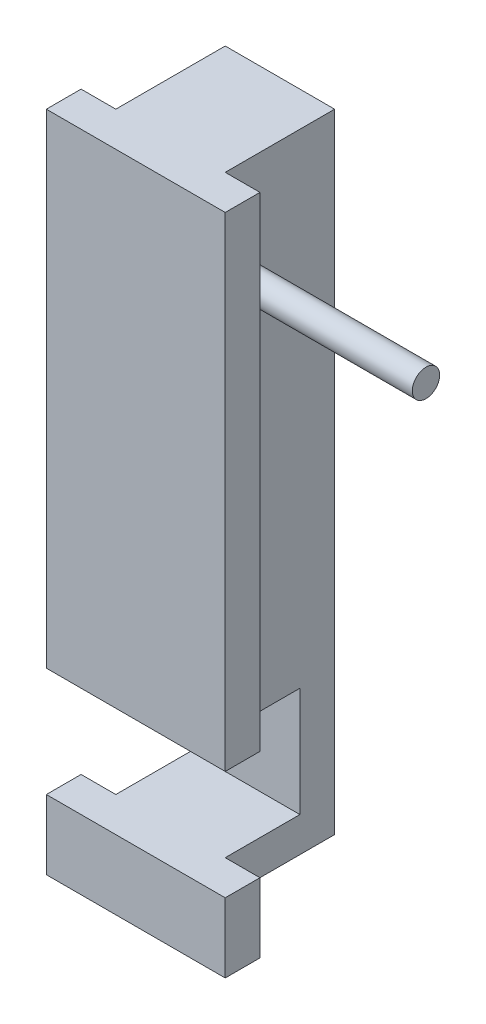
ISO-10303-21;
HEADER;
FILE_DESCRIPTION(('STEP AP214'),'2;1');
FILE_NAME('part.step','',(''),(''),'','','');
FILE_SCHEMA(('AUTOMOTIVE_DESIGN { 1 0 10303 214 1 1 1 1 }'));
ENDSEC;
DATA;
#1=APPLICATION_CONTEXT('core data for automotive mechanical design processes');
#2=APPLICATION_PROTOCOL_DEFINITION('international standard','automotive_design',2000,#1);
#3=PRODUCT_CONTEXT('',#1,'mechanical');
#4=PRODUCT('Part','Part','',(#3));
#5=PRODUCT_RELATED_PRODUCT_CATEGORY('part','',(#4));
#6=PRODUCT_DEFINITION_FORMATION('','',#4);
#7=PRODUCT_DEFINITION_CONTEXT('part definition',#1,'design');
#8=PRODUCT_DEFINITION('design','',#6,#7);
#9=PRODUCT_DEFINITION_SHAPE('','',#8);
#10=(LENGTH_UNIT() NAMED_UNIT(*) SI_UNIT(.MILLI.,.METRE.));
#11=(NAMED_UNIT(*) PLANE_ANGLE_UNIT() SI_UNIT($,.RADIAN.));
#12=(NAMED_UNIT(*) SI_UNIT($,.STERADIAN.) SOLID_ANGLE_UNIT());
#13=UNCERTAINTY_MEASURE_WITH_UNIT(LENGTH_MEASURE(1.E-05),#10,'distance_accuracy_value','');
#14=(GEOMETRIC_REPRESENTATION_CONTEXT(3) GLOBAL_UNCERTAINTY_ASSIGNED_CONTEXT((#13)) GLOBAL_UNIT_ASSIGNED_CONTEXT((#10,
#11,#12)) REPRESENTATION_CONTEXT('',''));
#15=CARTESIAN_POINT('',(0.,0.,0.));
#16=DIRECTION('',(0.,0.,1.));
#17=DIRECTION('',(1.,0.,0.));
#18=AXIS2_PLACEMENT_3D('',#15,#16,#17);
#19=CARTESIAN_POINT('',(32.7,0.,0.));
#20=DIRECTION('',(1.,0.,0.));
#21=DIRECTION('',(0.,0.,-1.));
#22=AXIS2_PLACEMENT_3D('',#19,#20,#21);
#23=PLANE('',#22);
#24=DIRECTION('',(0.,-1.,0.));
#25=VECTOR('',#24,1.);
#26=CARTESIAN_POINT('',(32.7,0.,-6.35));
#27=LINE('',#26,#25);
#28=CARTESIAN_POINT('',(32.7,88.5,-6.35));
#29=VERTEX_POINT('',#28);
#30=CARTESIAN_POINT('',(32.7,0.,-6.35));
#31=VERTEX_POINT('',#30);
#32=EDGE_CURVE('E48',#29,#31,#27,.T.);
#33=ORIENTED_EDGE('',*,*,#32,.F.);
#34=DIRECTION('',(0.,0.,1.));
#35=VECTOR('',#34,1.);
#36=CARTESIAN_POINT('',(32.7,88.5,-26.35));
#37=LINE('',#36,#35);
#38=CARTESIAN_POINT('',(32.7,88.5,0.));
#39=VERTEX_POINT('',#38);
#40=EDGE_CURVE('E64',#29,#39,#37,.T.);
#41=ORIENTED_EDGE('',*,*,#40,.T.);
#42=DIRECTION('',(0.,-1.,0.));
#43=VECTOR('',#42,1.);
#44=CARTESIAN_POINT('',(32.7,88.5,0.));
#45=LINE('',#44,#43);
#46=CARTESIAN_POINT('',(32.7,0.,0.));
#47=VERTEX_POINT('',#46);
#48=EDGE_CURVE('E161',#39,#47,#45,.T.);
#49=ORIENTED_EDGE('',*,*,#48,.T.);
#50=DIRECTION('',(0.,0.,-1.));
#51=VECTOR('',#50,1.);
#52=CARTESIAN_POINT('',(32.7,0.,0.));
#53=LINE('',#52,#51);
#54=EDGE_CURVE('E97',#47,#31,#53,.T.);
#55=ORIENTED_EDGE('',*,*,#54,.T.);
#56=EDGE_LOOP('',(#33,#41,#49,#55));
#57=FACE_BOUND('',#56,.T.);
#58=ADVANCED_FACE('F39',(#57),#23,.T.);
#59=CARTESIAN_POINT('',(0.,0.,0.));
#60=DIRECTION('',(1.,0.,0.));
#61=DIRECTION('',(0.,0.,-1.));
#62=AXIS2_PLACEMENT_3D('',#59,#60,#61);
#63=PLANE('',#62);
#64=DIRECTION('',(0.,0.,1.));
#65=VECTOR('',#64,1.);
#66=CARTESIAN_POINT('',(0.,88.5,-26.35));
#67=LINE('',#66,#65);
#68=CARTESIAN_POINT('',(0.,88.5,-6.35));
#69=VERTEX_POINT('',#68);
#70=CARTESIAN_POINT('',(0.,88.5,0.));
#71=VERTEX_POINT('',#70);
#72=EDGE_CURVE('E88',#69,#71,#67,.T.);
#73=ORIENTED_EDGE('',*,*,#72,.F.);
#74=DIRECTION('',(0.,-1.,0.));
#75=VECTOR('',#74,1.);
#76=CARTESIAN_POINT('',(0.,0.,-6.35));
#77=LINE('',#76,#75);
#78=CARTESIAN_POINT('',(0.,0.,-6.35));
#79=VERTEX_POINT('',#78);
#80=EDGE_CURVE('E191',#69,#79,#77,.T.);
#81=ORIENTED_EDGE('',*,*,#80,.T.);
#82=DIRECTION('',(0.,0.,-1.));
#83=VECTOR('',#82,1.);
#84=CARTESIAN_POINT('',(0.,0.,0.));
#85=LINE('',#84,#83);
#86=CARTESIAN_POINT('',(0.,0.,0.));
#87=VERTEX_POINT('',#86);
#88=EDGE_CURVE('E142',#87,#79,#85,.T.);
#89=ORIENTED_EDGE('',*,*,#88,.F.);
#90=DIRECTION('',(0.,-1.,0.));
#91=VECTOR('',#90,1.);
#92=CARTESIAN_POINT('',(0.,88.5,0.));
#93=LINE('',#92,#91);
#94=EDGE_CURVE('E138',#71,#87,#93,.T.);
#95=ORIENTED_EDGE('',*,*,#94,.F.);
#96=EDGE_LOOP('',(#73,#81,#89,#95));
#97=FACE_BOUND('',#96,.T.);
#98=ADVANCED_FACE('F349',(#97),#63,.F.);
#99=CARTESIAN_POINT('',(32.7,88.5,0.));
#100=DIRECTION('',(0.,0.,-1.));
#101=DIRECTION('',(0.,1.,0.));
#102=AXIS2_PLACEMENT_3D('',#99,#100,#101);
#103=PLANE('',#102);
#104=ORIENTED_EDGE('',*,*,#94,.T.);
#105=DIRECTION('',(-1.,0.,0.));
#106=VECTOR('',#105,1.);
#107=CARTESIAN_POINT('',(32.7,0.,0.));
#108=LINE('',#107,#106);
#109=EDGE_CURVE('E188',#47,#87,#108,.T.);
#110=ORIENTED_EDGE('',*,*,#109,.F.);
#111=ORIENTED_EDGE('',*,*,#48,.F.);
#112=DIRECTION('',(-1.,0.,0.));
#113=VECTOR('',#112,1.);
#114=CARTESIAN_POINT('',(32.7,88.5,0.));
#115=LINE('',#114,#113);
#116=EDGE_CURVE('E137',#39,#71,#115,.T.);
#117=ORIENTED_EDGE('',*,*,#116,.T.);
#118=EDGE_LOOP('',(#104,#110,#111,#117));
#119=FACE_BOUND('',#118,.T.);
#120=ADVANCED_FACE('F41',(#119),#103,.F.);
#121=CARTESIAN_POINT('',(32.7,0.,0.));
#122=DIRECTION('',(0.,1.,0.));
#123=DIRECTION('',(0.,0.,1.));
#124=AXIS2_PLACEMENT_3D('',#121,#122,#123);
#125=PLANE('',#124);
#126=DIRECTION('',(1.,0.,0.));
#127=VECTOR('',#126,1.);
#128=CARTESIAN_POINT('',(32.7,0.,-6.34999999999999));
#129=LINE('',#128,#127);
#130=CARTESIAN_POINT('',(6.35,0.,-6.35));
#131=VERTEX_POINT('',#130);
#132=EDGE_CURVE('E259',#79,#131,#129,.T.);
#133=ORIENTED_EDGE('',*,*,#132,.T.);
#134=DIRECTION('',(0.,0.,-1.));
#135=VECTOR('',#134,1.);
#136=CARTESIAN_POINT('',(6.35,0.,0.));
#137=LINE('',#136,#135);
#138=CARTESIAN_POINT('',(6.35,0.,-20.));
#139=VERTEX_POINT('',#138);
#140=EDGE_CURVE('E143',#131,#139,#137,.T.);
#141=ORIENTED_EDGE('',*,*,#140,.T.);
#142=DIRECTION('',(-1.,0.,0.));
#143=VECTOR('',#142,1.);
#144=CARTESIAN_POINT('',(32.7,0.,-20.));
#145=LINE('',#144,#143);
#146=CARTESIAN_POINT('',(26.35,0.,-20.));
#147=VERTEX_POINT('',#146);
#148=EDGE_CURVE('E184',#147,#139,#145,.T.);
#149=ORIENTED_EDGE('',*,*,#148,.F.);
#150=DIRECTION('',(0.,0.,1.));
#151=VECTOR('',#150,1.);
#152=CARTESIAN_POINT('',(26.35,0.,0.));
#153=LINE('',#152,#151);
#154=CARTESIAN_POINT('',(26.35,0.,-6.35));
#155=VERTEX_POINT('',#154);
#156=EDGE_CURVE('E215',#147,#155,#153,.T.);
#157=ORIENTED_EDGE('',*,*,#156,.T.);
#158=DIRECTION('',(1.,0.,0.));
#159=VECTOR('',#158,1.);
#160=CARTESIAN_POINT('',(32.7,0.,-6.35));
#161=LINE('',#160,#159);
#162=EDGE_CURVE('E203',#155,#31,#161,.T.);
#163=ORIENTED_EDGE('',*,*,#162,.T.);
#164=ORIENTED_EDGE('',*,*,#54,.F.);
#165=ORIENTED_EDGE('',*,*,#109,.T.);
#166=ORIENTED_EDGE('',*,*,#88,.T.);
#167=EDGE_LOOP('',(#133,#141,#149,#157,#163,#164,#165,#166));
#168=FACE_BOUND('',#167,.T.);
#169=ADVANCED_FACE('F212',(#168),#125,.F.);
#170=CARTESIAN_POINT('',(32.7,0.,-20.));
#171=DIRECTION('',(0.,0.,-1.));
#172=DIRECTION('',(0.,1.,0.));
#173=AXIS2_PLACEMENT_3D('',#170,#171,#172);
#174=PLANE('',#173);
#175=ORIENTED_EDGE('',*,*,#148,.T.);
#176=DIRECTION('',(0.,-1.,0.));
#177=VECTOR('',#176,1.);
#178=CARTESIAN_POINT('',(6.35,0.,-20.));
#179=LINE('',#178,#177);
#180=CARTESIAN_POINT('',(6.35,-20.,-20.));
#181=VERTEX_POINT('',#180);
#182=EDGE_CURVE('E231',#139,#181,#179,.T.);
#183=ORIENTED_EDGE('',*,*,#182,.T.);
#184=DIRECTION('',(-1.,0.,0.));
#185=VECTOR('',#184,1.);
#186=CARTESIAN_POINT('',(32.7,-20.,-20.));
#187=LINE('',#186,#185);
#188=CARTESIAN_POINT('',(26.35,-20.,-20.));
#189=VERTEX_POINT('',#188);
#190=EDGE_CURVE('E180',#189,#181,#187,.T.);
#191=ORIENTED_EDGE('',*,*,#190,.F.);
#192=DIRECTION('',(0.,1.,0.));
#193=VECTOR('',#192,1.);
#194=CARTESIAN_POINT('',(26.35,0.,-20.));
#195=LINE('',#194,#193);
#196=EDGE_CURVE('E245',#189,#147,#195,.T.);
#197=ORIENTED_EDGE('',*,*,#196,.T.);
#198=EDGE_LOOP('',(#175,#183,#191,#197));
#199=FACE_BOUND('',#198,.T.);
#200=ADVANCED_FACE('F328',(#199),#174,.F.);
#201=CARTESIAN_POINT('',(32.7,-20.,-20.));
#202=DIRECTION('',(0.,-1.,0.));
#203=DIRECTION('',(0.,0.,-1.));
#204=AXIS2_PLACEMENT_3D('',#201,#202,#203);
#205=PLANE('',#204);
#206=ORIENTED_EDGE('',*,*,#190,.T.);
#207=DIRECTION('',(0.,0.,1.));
#208=VECTOR('',#207,1.);
#209=CARTESIAN_POINT('',(6.35,-20.,-20.));
#210=LINE('',#209,#208);
#211=CARTESIAN_POINT('',(6.35,-20.,-6.35));
#212=VERTEX_POINT('',#211);
#213=EDGE_CURVE('E235',#181,#212,#210,.T.);
#214=ORIENTED_EDGE('',*,*,#213,.T.);
#215=DIRECTION('',(-1.,0.,0.));
#216=VECTOR('',#215,1.);
#217=CARTESIAN_POINT('',(32.7,-20.,-6.34999999999999));
#218=LINE('',#217,#216);
#219=CARTESIAN_POINT('',(0.,-20.,-6.35));
#220=VERTEX_POINT('',#219);
#221=EDGE_CURVE('E262',#212,#220,#218,.T.);
#222=ORIENTED_EDGE('',*,*,#221,.T.);
#223=DIRECTION('',(0.,0.,1.));
#224=VECTOR('',#223,1.);
#225=CARTESIAN_POINT('',(0.,-20.,-20.));
#226=LINE('',#225,#224);
#227=CARTESIAN_POINT('',(0.,-20.,0.));
#228=VERTEX_POINT('',#227);
#229=EDGE_CURVE('E147',#220,#228,#226,.T.);
#230=ORIENTED_EDGE('',*,*,#229,.T.);
#231=DIRECTION('',(-1.,0.,0.));
#232=VECTOR('',#231,1.);
#233=CARTESIAN_POINT('',(32.7,-20.,0.));
#234=LINE('',#233,#232);
#235=CARTESIAN_POINT('',(32.7,-20.,0.));
#236=VERTEX_POINT('',#235);
#237=EDGE_CURVE('E125',#236,#228,#234,.T.);
#238=ORIENTED_EDGE('',*,*,#237,.F.);
#239=DIRECTION('',(0.,0.,1.));
#240=VECTOR('',#239,1.);
#241=CARTESIAN_POINT('',(32.7,-20.,-20.));
#242=LINE('',#241,#240);
#243=CARTESIAN_POINT('',(32.7,-20.,-6.35));
#244=VERTEX_POINT('',#243);
#245=EDGE_CURVE('E110',#244,#236,#242,.T.);
#246=ORIENTED_EDGE('',*,*,#245,.F.);
#247=DIRECTION('',(-1.,0.,0.));
#248=VECTOR('',#247,1.);
#249=CARTESIAN_POINT('',(32.7,-20.,-6.35));
#250=LINE('',#249,#248);
#251=CARTESIAN_POINT('',(26.35,-20.,-6.35));
#252=VERTEX_POINT('',#251);
#253=EDGE_CURVE('E218',#244,#252,#250,.T.);
#254=ORIENTED_EDGE('',*,*,#253,.T.);
#255=DIRECTION('',(0.,0.,-1.));
#256=VECTOR('',#255,1.);
#257=CARTESIAN_POINT('',(26.35,-20.,-20.));
#258=LINE('',#257,#256);
#259=EDGE_CURVE('E249',#252,#189,#258,.T.);
#260=ORIENTED_EDGE('',*,*,#259,.T.);
#261=EDGE_LOOP('',(#206,#214,#222,#230,#238,#246,#254,#260));
#262=FACE_BOUND('',#261,.T.);
#263=ADVANCED_FACE('F326',(#262),#205,.F.);
#264=CARTESIAN_POINT('',(32.7,-20.,0.));
#265=DIRECTION('',(0.,0.,-1.));
#266=DIRECTION('',(0.,1.,0.));
#267=AXIS2_PLACEMENT_3D('',#264,#265,#266);
#268=PLANE('',#267);
#269=DIRECTION('',(0.,-1.,0.));
#270=VECTOR('',#269,1.);
#271=CARTESIAN_POINT('',(0.,-20.,0.));
#272=LINE('',#271,#270);
#273=CARTESIAN_POINT('',(0.,-32.7,0.));
#274=VERTEX_POINT('',#273);
#275=EDGE_CURVE('E120',#228,#274,#272,.T.);
#276=ORIENTED_EDGE('',*,*,#275,.T.);
#277=DIRECTION('',(-1.,0.,0.));
#278=VECTOR('',#277,1.);
#279=CARTESIAN_POINT('',(32.7,-32.7,0.));
#280=LINE('',#279,#278);
#281=CARTESIAN_POINT('',(32.7,-32.7,0.));
#282=VERTEX_POINT('',#281);
#283=EDGE_CURVE('E117',#282,#274,#280,.T.);
#284=ORIENTED_EDGE('',*,*,#283,.F.);
#285=DIRECTION('',(0.,-1.,0.));
#286=VECTOR('',#285,1.);
#287=CARTESIAN_POINT('',(32.7,-20.,0.));
#288=LINE('',#287,#286);
#289=EDGE_CURVE('E103',#236,#282,#288,.T.);
#290=ORIENTED_EDGE('',*,*,#289,.F.);
#291=ORIENTED_EDGE('',*,*,#237,.T.);
#292=EDGE_LOOP('',(#276,#284,#290,#291));
#293=FACE_BOUND('',#292,.T.);
#294=ADVANCED_FACE('F118',(#293),#268,.F.);
#295=CARTESIAN_POINT('',(32.7,-32.7,0.));
#296=DIRECTION('',(0.,1.,0.));
#297=DIRECTION('',(0.,0.,1.));
#298=AXIS2_PLACEMENT_3D('',#295,#296,#297);
#299=PLANE('',#298);
#300=DIRECTION('',(0.,0.,-1.));
#301=VECTOR('',#300,1.);
#302=CARTESIAN_POINT('',(0.,-32.7,0.));
#303=LINE('',#302,#301);
#304=CARTESIAN_POINT('',(0.,-32.7,-6.35));
#305=VERTEX_POINT('',#304);
#306=EDGE_CURVE('E152',#274,#305,#303,.T.);
#307=ORIENTED_EDGE('',*,*,#306,.T.);
#308=DIRECTION('',(-1.,0.,0.));
#309=VECTOR('',#308,1.);
#310=CARTESIAN_POINT('',(32.7,-32.7,-6.35));
#311=LINE('',#310,#309);
#312=CARTESIAN_POINT('',(32.7,-32.7,-6.35));
#313=VERTEX_POINT('',#312);
#314=EDGE_CURVE('E126',#313,#305,#311,.T.);
#315=ORIENTED_EDGE('',*,*,#314,.F.);
#316=DIRECTION('',(0.,0.,-1.));
#317=VECTOR('',#316,1.);
#318=CARTESIAN_POINT('',(32.7,-32.7,0.));
#319=LINE('',#318,#317);
#320=EDGE_CURVE('E107',#282,#313,#319,.T.);
#321=ORIENTED_EDGE('',*,*,#320,.F.);
#322=ORIENTED_EDGE('',*,*,#283,.T.);
#323=EDGE_LOOP('',(#307,#315,#321,#322));
#324=FACE_BOUND('',#323,.T.);
#325=ADVANCED_FACE('F128',(#324),#299,.F.);
#326=CARTESIAN_POINT('',(32.7,-32.7,-6.35));
#327=DIRECTION('',(0.,0.,1.));
#328=DIRECTION('',(1.,0.,0.));
#329=AXIS2_PLACEMENT_3D('',#326,#327,#328);
#330=PLANE('',#329);
#331=ORIENTED_EDGE('',*,*,#314,.T.);
#332=DIRECTION('',(0.,1.,0.));
#333=VECTOR('',#332,1.);
#334=CARTESIAN_POINT('',(0.,-32.7,-6.35));
#335=LINE('',#334,#333);
#336=EDGE_CURVE('E155',#305,#220,#335,.T.);
#337=ORIENTED_EDGE('',*,*,#336,.T.);
#338=ORIENTED_EDGE('',*,*,#221,.F.);
#339=DIRECTION('',(0.,1.,0.));
#340=VECTOR('',#339,1.);
#341=CARTESIAN_POINT('',(6.35,-32.7,-6.35));
#342=LINE('',#341,#340);
#343=CARTESIAN_POINT('',(6.35,-26.35,-6.35));
#344=VERTEX_POINT('',#343);
#345=EDGE_CURVE('E286',#344,#212,#342,.T.);
#346=ORIENTED_EDGE('',*,*,#345,.F.);
#347=DIRECTION('',(-1.,0.,0.));
#348=VECTOR('',#347,1.);
#349=CARTESIAN_POINT('',(32.7,-26.35,-6.35));
#350=LINE('',#349,#348);
#351=CARTESIAN_POINT('',(26.35,-26.35,-6.35));
#352=VERTEX_POINT('',#351);
#353=EDGE_CURVE('E172',#352,#344,#350,.T.);
#354=ORIENTED_EDGE('',*,*,#353,.F.);
#355=DIRECTION('',(0.,1.,0.));
#356=VECTOR('',#355,1.);
#357=CARTESIAN_POINT('',(26.35,-32.7,-6.35));
#358=LINE('',#357,#356);
#359=EDGE_CURVE('E274',#352,#252,#358,.T.);
#360=ORIENTED_EDGE('',*,*,#359,.T.);
#361=ORIENTED_EDGE('',*,*,#253,.F.);
#362=DIRECTION('',(0.,1.,0.));
#363=VECTOR('',#362,1.);
#364=CARTESIAN_POINT('',(32.7,-32.7,-6.35));
#365=LINE('',#364,#363);
#366=EDGE_CURVE('E55',#313,#244,#365,.T.);
#367=ORIENTED_EDGE('',*,*,#366,.F.);
#368=EDGE_LOOP('',(#331,#337,#338,#346,#354,#360,#361,#367));
#369=FACE_BOUND('',#368,.T.);
#370=ADVANCED_FACE('F386',(#369),#330,.F.);
#371=CARTESIAN_POINT('',(32.7,-26.35,-6.35));
#372=DIRECTION('',(0.,1.,0.));
#373=DIRECTION('',(0.,0.,1.));
#374=AXIS2_PLACEMENT_3D('',#371,#372,#373);
#375=PLANE('',#374);
#376=ORIENTED_EDGE('',*,*,#353,.T.);
#377=DIRECTION('',(0.,0.,-1.));
#378=VECTOR('',#377,1.);
#379=CARTESIAN_POINT('',(6.35,-26.35,-6.35));
#380=LINE('',#379,#378);
#381=CARTESIAN_POINT('',(6.35,-26.35,-26.35));
#382=VERTEX_POINT('',#381);
#383=EDGE_CURVE('E239',#344,#382,#380,.T.);
#384=ORIENTED_EDGE('',*,*,#383,.T.);
#385=DIRECTION('',(-1.,0.,0.));
#386=VECTOR('',#385,1.);
#387=CARTESIAN_POINT('',(32.7,-26.35,-26.35));
#388=LINE('',#387,#386);
#389=CARTESIAN_POINT('',(26.35,-26.35,-26.35));
#390=VERTEX_POINT('',#389);
#391=EDGE_CURVE('E168',#390,#382,#388,.T.);
#392=ORIENTED_EDGE('',*,*,#391,.F.);
#393=DIRECTION('',(0.,0.,1.));
#394=VECTOR('',#393,1.);
#395=CARTESIAN_POINT('',(26.35,-26.35,-6.35));
#396=LINE('',#395,#394);
#397=EDGE_CURVE('E217',#390,#352,#396,.T.);
#398=ORIENTED_EDGE('',*,*,#397,.T.);
#399=EDGE_LOOP('',(#376,#384,#392,#398));
#400=FACE_BOUND('',#399,.T.);
#401=ADVANCED_FACE('F383',(#400),#375,.F.);
#402=CARTESIAN_POINT('',(32.7,-26.35,-26.35));
#403=DIRECTION('',(0.,0.,1.));
#404=DIRECTION('',(1.,0.,0.));
#405=AXIS2_PLACEMENT_3D('',#402,#403,#404);
#406=PLANE('',#405);
#407=ORIENTED_EDGE('',*,*,#391,.T.);
#408=DIRECTION('',(0.,1.,0.));
#409=VECTOR('',#408,1.);
#410=CARTESIAN_POINT('',(6.35,-32.7,-26.35));
#411=LINE('',#410,#409);
#412=CARTESIAN_POINT('',(6.35,88.5,-26.35));
#413=VERTEX_POINT('',#412);
#414=EDGE_CURVE('E266',#382,#413,#411,.T.);
#415=ORIENTED_EDGE('',*,*,#414,.T.);
#416=DIRECTION('',(-1.,0.,0.));
#417=VECTOR('',#416,1.);
#418=CARTESIAN_POINT('',(32.7,88.5,-26.35));
#419=LINE('',#418,#417);
#420=CARTESIAN_POINT('',(26.35,88.5,-26.35));
#421=VERTEX_POINT('',#420);
#422=EDGE_CURVE('E164',#421,#413,#419,.T.);
#423=ORIENTED_EDGE('',*,*,#422,.F.);
#424=DIRECTION('',(0.,1.,0.));
#425=VECTOR('',#424,1.);
#426=CARTESIAN_POINT('',(26.35,-32.7,-26.35));
#427=LINE('',#426,#425);
#428=EDGE_CURVE('E267',#390,#421,#427,.T.);
#429=ORIENTED_EDGE('',*,*,#428,.F.);
#430=EDGE_LOOP('',(#407,#415,#423,#429));
#431=FACE_BOUND('',#430,.T.);
#432=ADVANCED_FACE('F382',(#431),#406,.F.);
#433=CARTESIAN_POINT('',(32.7,88.5,-26.35));
#434=DIRECTION('',(0.,-1.,0.));
#435=DIRECTION('',(0.,0.,-1.));
#436=AXIS2_PLACEMENT_3D('',#433,#434,#435);
#437=PLANE('',#436);
#438=ORIENTED_EDGE('',*,*,#422,.T.);
#439=DIRECTION('',(0.,0.,-1.));
#440=VECTOR('',#439,1.);
#441=CARTESIAN_POINT('',(6.35,88.5,-26.35));
#442=LINE('',#441,#440);
#443=CARTESIAN_POINT('',(6.35,88.5,-6.35));
#444=VERTEX_POINT('',#443);
#445=EDGE_CURVE('E287',#444,#413,#442,.T.);
#446=ORIENTED_EDGE('',*,*,#445,.F.);
#447=DIRECTION('',(1.,0.,0.));
#448=VECTOR('',#447,1.);
#449=CARTESIAN_POINT('',(6.35,88.5,-6.35));
#450=LINE('',#449,#448);
#451=EDGE_CURVE('E294',#69,#444,#450,.T.);
#452=ORIENTED_EDGE('',*,*,#451,.F.);
#453=ORIENTED_EDGE('',*,*,#72,.T.);
#454=ORIENTED_EDGE('',*,*,#116,.F.);
#455=ORIENTED_EDGE('',*,*,#40,.F.);
#456=DIRECTION('',(1.,0.,0.));
#457=VECTOR('',#456,1.);
#458=CARTESIAN_POINT('',(32.7,88.5,-6.35));
#459=LINE('',#458,#457);
#460=CARTESIAN_POINT('',(26.35,88.5,-6.35));
#461=VERTEX_POINT('',#460);
#462=EDGE_CURVE('E207',#461,#29,#459,.T.);
#463=ORIENTED_EDGE('',*,*,#462,.F.);
#464=DIRECTION('',(0.,0.,1.));
#465=VECTOR('',#464,1.);
#466=CARTESIAN_POINT('',(26.35,88.5,-6.35));
#467=LINE('',#466,#465);
#468=EDGE_CURVE('E277',#421,#461,#467,.T.);
#469=ORIENTED_EDGE('',*,*,#468,.F.);
#470=EDGE_LOOP('',(#438,#446,#452,#453,#454,#455,#463,#469));
#471=FACE_BOUND('',#470,.T.);
#472=ADVANCED_FACE('F400',(#471),#437,.F.);
#473=ORIENTED_EDGE('',*,*,#366,.T.);
#474=ORIENTED_EDGE('',*,*,#245,.T.);
#475=ORIENTED_EDGE('',*,*,#289,.T.);
#476=ORIENTED_EDGE('',*,*,#320,.T.);
#477=EDGE_LOOP('',(#473,#474,#475,#476));
#478=FACE_BOUND('',#477,.T.);
#479=ADVANCED_FACE('F105',(#478),#23,.T.);
#480=ORIENTED_EDGE('',*,*,#229,.F.);
#481=ORIENTED_EDGE('',*,*,#336,.F.);
#482=ORIENTED_EDGE('',*,*,#306,.F.);
#483=ORIENTED_EDGE('',*,*,#275,.F.);
#484=EDGE_LOOP('',(#480,#481,#482,#483));
#485=FACE_BOUND('',#484,.T.);
#486=ADVANCED_FACE('F391',(#485),#63,.F.);
#487=CARTESIAN_POINT('',(6.35,-32.7,-26.35));
#488=DIRECTION('',(1.,0.,0.));
#489=DIRECTION('',(0.,0.,-1.));
#490=AXIS2_PLACEMENT_3D('',#487,#488,#489);
#491=PLANE('',#490);
#492=EDGE_CURVE('E282',#131,#444,#342,.T.);
#493=ORIENTED_EDGE('',*,*,#492,.T.);
#494=ORIENTED_EDGE('',*,*,#445,.T.);
#495=ORIENTED_EDGE('',*,*,#414,.F.);
#496=ORIENTED_EDGE('',*,*,#383,.F.);
#497=ORIENTED_EDGE('',*,*,#345,.T.);
#498=ORIENTED_EDGE('',*,*,#213,.F.);
#499=ORIENTED_EDGE('',*,*,#182,.F.);
#500=ORIENTED_EDGE('',*,*,#140,.F.);
#501=EDGE_LOOP('',(#493,#494,#495,#496,#497,#498,#499,#500));
#502=FACE_BOUND('',#501,.T.);
#503=ADVANCED_FACE('F333',(#502),#491,.F.);
#504=CARTESIAN_POINT('',(6.35,-32.7,-6.35));
#505=DIRECTION('',(0.,0.,1.));
#506=DIRECTION('',(1.,0.,0.));
#507=AXIS2_PLACEMENT_3D('',#504,#505,#506);
#508=PLANE('',#507);
#509=ORIENTED_EDGE('',*,*,#80,.F.);
#510=ORIENTED_EDGE('',*,*,#451,.T.);
#511=ORIENTED_EDGE('',*,*,#492,.F.);
#512=ORIENTED_EDGE('',*,*,#132,.F.);
#513=EDGE_LOOP('',(#509,#510,#511,#512));
#514=FACE_BOUND('',#513,.T.);
#515=ADVANCED_FACE('F313',(#514),#508,.F.);
#516=CARTESIAN_POINT('',(26.35,-32.7,-6.35));
#517=DIRECTION('',(-1.,0.,0.));
#518=DIRECTION('',(0.,0.,1.));
#519=AXIS2_PLACEMENT_3D('',#516,#517,#518);
#520=PLANE('',#519);
#521=CARTESIAN_POINT('',(26.35,69.86,-9.99999999999999));
#522=DIRECTION('',(-1.,0.,0.));
#523=DIRECTION('',(0.,0.,1.));
#524=AXIS2_PLACEMENT_3D('',#521,#522,#523);
#525=CIRCLE('',#524,2.5);
#526=CARTESIAN_POINT('',(26.35,69.86,-7.5));
#527=VERTEX_POINT('',#526);
#528=EDGE_CURVE('E11',#527,#527,#525,.F.);
#529=ORIENTED_EDGE('',*,*,#528,.F.);
#530=EDGE_LOOP('',(#529));
#531=FACE_BOUND('',#530,.T.);
#532=ORIENTED_EDGE('',*,*,#196,.F.);
#533=ORIENTED_EDGE('',*,*,#259,.F.);
#534=ORIENTED_EDGE('',*,*,#359,.F.);
#535=ORIENTED_EDGE('',*,*,#397,.F.);
#536=ORIENTED_EDGE('',*,*,#428,.T.);
#537=ORIENTED_EDGE('',*,*,#468,.T.);
#538=EDGE_CURVE('E271',#155,#461,#358,.T.);
#539=ORIENTED_EDGE('',*,*,#538,.F.);
#540=ORIENTED_EDGE('',*,*,#156,.F.);
#541=EDGE_LOOP('',(#532,#533,#534,#535,#536,#537,#539,#540));
#542=FACE_BOUND('',#541,.T.);
#543=ADVANCED_FACE('F310',(#531,#542),#520,.F.);
#544=CARTESIAN_POINT('',(32.7,-32.7,-6.35));
#545=DIRECTION('',(0.,0.,1.));
#546=DIRECTION('',(1.,0.,0.));
#547=AXIS2_PLACEMENT_3D('',#544,#545,#546);
#548=PLANE('',#547);
#549=ORIENTED_EDGE('',*,*,#538,.T.);
#550=ORIENTED_EDGE('',*,*,#462,.T.);
#551=ORIENTED_EDGE('',*,*,#32,.T.);
#552=ORIENTED_EDGE('',*,*,#162,.F.);
#553=EDGE_LOOP('',(#549,#550,#551,#552));
#554=FACE_BOUND('',#553,.T.);
#555=ADVANCED_FACE('F201',(#554),#548,.F.);
#556=CARTESIAN_POINT('',(59.4,69.86,-9.99999999999999));
#557=DIRECTION('',(-1.,0.,0.));
#558=DIRECTION('',(0.,0.,1.));
#559=AXIS2_PLACEMENT_3D('',#556,#557,#558);
#560=CYLINDRICAL_SURFACE('',#559,2.5);
#561=CARTESIAN_POINT('',(59.4,69.86,-9.99999999999999));
#562=DIRECTION('',(1.,0.,0.));
#563=DIRECTION('',(0.,0.,-1.));
#564=AXIS2_PLACEMENT_3D('',#561,#562,#563);
#565=CIRCLE('',#564,2.5);
#566=CARTESIAN_POINT('',(59.4,69.86,-12.5));
#567=VERTEX_POINT('',#566);
#568=EDGE_CURVE('E281',#567,#567,#565,.T.);
#569=ORIENTED_EDGE('',*,*,#568,.F.);
#570=EDGE_LOOP('',(#569));
#571=FACE_BOUND('',#570,.T.);
#572=ORIENTED_EDGE('',*,*,#528,.T.);
#573=EDGE_LOOP('',(#572));
#574=FACE_BOUND('',#573,.T.);
#575=ADVANCED_FACE('F304',(#571,#574),#560,.T.);
#576=CARTESIAN_POINT('',(59.4,69.86,-9.99999999999999));
#577=DIRECTION('',(1.,0.,0.));
#578=DIRECTION('',(0.,0.,-1.));
#579=AXIS2_PLACEMENT_3D('',#576,#577,#578);
#580=PLANE('',#579);
#581=ORIENTED_EDGE('',*,*,#568,.T.);
#582=EDGE_LOOP('',(#581));
#583=FACE_BOUND('',#582,.T.);
#584=ADVANCED_FACE('F302',(#583),#580,.T.);
#585=CLOSED_SHELL('',(#58,#98,#120,#169,#200,#263,#294,#325,#370,#401,#432,#472,#479,#486,#503,
#515,#543,#555,#575,#584));
#586=MANIFOLD_SOLID_BREP('B2',#585);
#587=ADVANCED_BREP_SHAPE_REPRESENTATION('',(#18,#586),#14);
#588=SHAPE_DEFINITION_REPRESENTATION(#9,#587);
ENDSEC;
END-ISO-10303-21;
